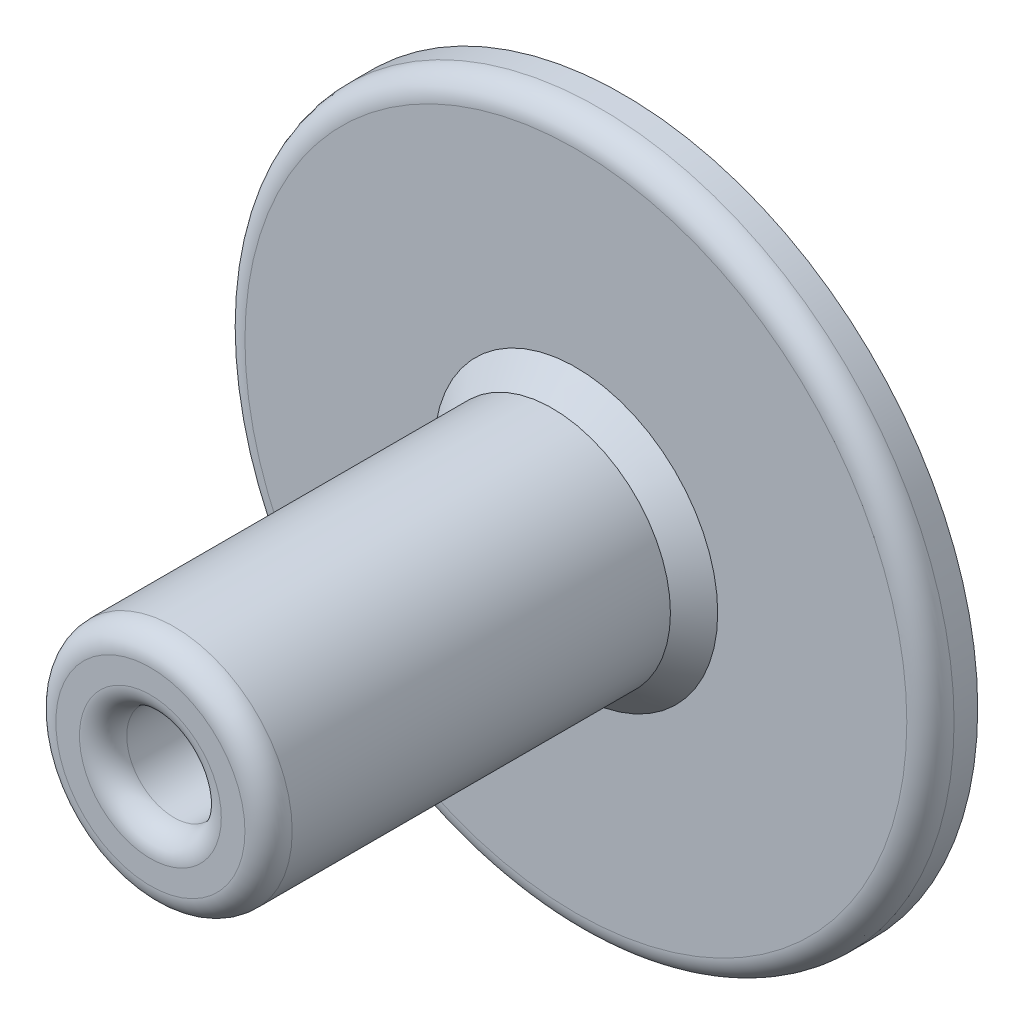
ISO-10303-21;
HEADER;
FILE_DESCRIPTION(('STEP AP214'),'2;1');
FILE_NAME('part.step','',(''),(''),'','','');
FILE_SCHEMA(('AUTOMOTIVE_DESIGN { 1 0 10303 214 1 1 1 1 }'));
ENDSEC;
DATA;
#1=APPLICATION_CONTEXT('core data for automotive mechanical design processes');
#2=APPLICATION_PROTOCOL_DEFINITION('international standard','automotive_design',2000,#1);
#3=PRODUCT_CONTEXT('',#1,'mechanical');
#4=PRODUCT('Part','Part','',(#3));
#5=PRODUCT_RELATED_PRODUCT_CATEGORY('part','',(#4));
#6=PRODUCT_DEFINITION_FORMATION('','',#4);
#7=PRODUCT_DEFINITION_CONTEXT('part definition',#1,'design');
#8=PRODUCT_DEFINITION('design','',#6,#7);
#9=PRODUCT_DEFINITION_SHAPE('','',#8);
#10=(LENGTH_UNIT() NAMED_UNIT(*) SI_UNIT(.MILLI.,.METRE.));
#11=(NAMED_UNIT(*) PLANE_ANGLE_UNIT() SI_UNIT($,.RADIAN.));
#12=(NAMED_UNIT(*) SI_UNIT($,.STERADIAN.) SOLID_ANGLE_UNIT());
#13=UNCERTAINTY_MEASURE_WITH_UNIT(LENGTH_MEASURE(1.E-05),#10,'distance_accuracy_value','');
#14=(GEOMETRIC_REPRESENTATION_CONTEXT(3) GLOBAL_UNCERTAINTY_ASSIGNED_CONTEXT((#13)) GLOBAL_UNIT_ASSIGNED_CONTEXT((#10,
#11,#12)) REPRESENTATION_CONTEXT('',''));
#15=CARTESIAN_POINT('',(0.,0.,0.));
#16=DIRECTION('',(0.,0.,1.));
#17=DIRECTION('',(1.,0.,0.));
#18=AXIS2_PLACEMENT_3D('',#15,#16,#17);
#19=CARTESIAN_POINT('',(0.,0.,2.));
#20=DIRECTION('',(0.,0.,-1.));
#21=DIRECTION('',(-1.,0.,0.));
#22=AXIS2_PLACEMENT_3D('',#19,#20,#21);
#23=CYLINDRICAL_SURFACE('',#22,15.);
#24=CARTESIAN_POINT('',(0.,0.,1.));
#25=DIRECTION('',(0.,0.,1.));
#26=DIRECTION('',(1.,0.,0.));
#27=AXIS2_PLACEMENT_3D('',#24,#25,#26);
#28=CIRCLE('',#27,15.);
#29=CARTESIAN_POINT('',(15.,0.,1.));
#30=VERTEX_POINT('',#29);
#31=EDGE_CURVE('E53',#30,#30,#28,.F.);
#32=ORIENTED_EDGE('',*,*,#31,.T.);
#33=EDGE_LOOP('',(#32));
#34=FACE_BOUND('',#33,.T.);
#35=CARTESIAN_POINT('',(0.,0.,0.));
#36=DIRECTION('',(0.,0.,1.));
#37=DIRECTION('',(1.,0.,0.));
#38=AXIS2_PLACEMENT_3D('',#35,#36,#37);
#39=CIRCLE('',#38,15.);
#40=CARTESIAN_POINT('',(15.,0.,0.));
#41=VERTEX_POINT('',#40);
#42=EDGE_CURVE('E141',#41,#41,#39,.T.);
#43=ORIENTED_EDGE('',*,*,#42,.T.);
#44=EDGE_LOOP('',(#43));
#45=FACE_BOUND('',#44,.T.);
#46=ADVANCED_FACE('F33',(#34,#45),#23,.T.);
#47=CARTESIAN_POINT('',(0.,0.,2.));
#48=DIRECTION('',(0.,0.,1.));
#49=DIRECTION('',(1.,0.,0.));
#50=AXIS2_PLACEMENT_3D('',#47,#48,#49);
#51=PLANE('',#50);
#52=CARTESIAN_POINT('',(0.,0.,2.));
#53=DIRECTION('',(0.,0.,1.));
#54=DIRECTION('',(1.,0.,0.));
#55=AXIS2_PLACEMENT_3D('',#52,#53,#54);
#56=CIRCLE('',#55,14.);
#57=CARTESIAN_POINT('',(14.,0.,2.));
#58=VERTEX_POINT('',#57);
#59=EDGE_CURVE('E56',#58,#58,#56,.T.);
#60=ORIENTED_EDGE('',*,*,#59,.T.);
#61=EDGE_LOOP('',(#60));
#62=FACE_BOUND('',#61,.T.);
#63=CARTESIAN_POINT('',(0.,0.,2.));
#64=DIRECTION('',(0.,0.,1.));
#65=DIRECTION('',(1.,0.,0.));
#66=AXIS2_PLACEMENT_3D('',#63,#64,#65);
#67=CIRCLE('',#66,6.);
#68=CARTESIAN_POINT('',(6.,0.,2.));
#69=VERTEX_POINT('',#68);
#70=EDGE_CURVE('E59',#69,#69,#67,.F.);
#71=ORIENTED_EDGE('',*,*,#70,.T.);
#72=EDGE_LOOP('',(#71));
#73=FACE_BOUND('',#72,.T.);
#74=ADVANCED_FACE('F105',(#62,#73),#51,.T.);
#75=CARTESIAN_POINT('',(0.,0.,0.));
#76=DIRECTION('',(0.,0.,1.));
#77=DIRECTION('',(1.,0.,0.));
#78=AXIS2_PLACEMENT_3D('',#75,#76,#77);
#79=PLANE('',#78);
#80=CARTESIAN_POINT('',(-3.66679137106912,-0.429664729131932,0.));
#81=CARTESIAN_POINT('',(-2.67863752521124,-0.276198195593573,0.));
#82=CARTESIAN_POINT('',(-2.67863752521124,-0.276198195593573,1.));
#83=CARTESIAN_POINT('',(-3.69196284115089,-0.267625344794725,0.));
#84=CARTESIAN_POINT('',(-2.69486440992087,-0.171736758762703,0.));
#85=CARTESIAN_POINT('',(-2.69486440992087,-0.171736758762703,1.));
#86=CARTESIAN_POINT('',(-3.70290083888142,-0.103396836765117,0.));
#87=CARTESIAN_POINT('',(-2.70186208637592,-0.0663814484191467,0.));
#88=CARTESIAN_POINT('',(-2.70186208637592,-0.0663814484191467,1.));
#89=CARTESIAN_POINT('',(-3.69578827229148,0.22440005978216,0.));
#90=CARTESIAN_POINT('',(-2.69729640552077,0.144056797802076,0.));
#91=CARTESIAN_POINT('',(-2.69729640552077,0.144056797802076,1.));
#92=CARTESIAN_POINT('',(-3.67774673628734,0.387968637980828,0.));
#93=CARTESIAN_POINT('',(-2.68573882893539,0.249139808297535,0.));
#94=CARTESIAN_POINT('',(-2.68573882893539,0.249139808297535,1.));
#95=CARTESIAN_POINT('',(-3.61488777481417,0.703048246575832,0.));
#96=CARTESIAN_POINT('',(-2.64510508481496,0.452798082427513,0.));
#97=CARTESIAN_POINT('',(-2.64510508481496,0.452798082427513,1.));
#98=CARTESIAN_POINT('',(-3.57116384486128,0.854780094129729,0.));
#99=CARTESIAN_POINT('',(-2.61674396592666,0.551465948864588,0.));
#100=CARTESIAN_POINT('',(-2.61674396592666,0.551465948864588,1.));
#101=CARTESIAN_POINT('',(-3.45979416995086,1.14915436400107,0.));
#102=CARTESIAN_POINT('',(-2.54361641143537,0.744750712859358,0.));
#103=CARTESIAN_POINT('',(-2.54361641143537,0.744750712859358,1.));
#104=CARTESIAN_POINT('',(-3.39214641981463,1.29179602323988,0.));
#105=CARTESIAN_POINT('',(-2.49884860069155,0.839367270110499,0.));
#106=CARTESIAN_POINT('',(-2.49884860069155,0.839367270110499,1.));
#107=CARTESIAN_POINT('',(-3.23256253772176,1.57019486369897,0.));
#108=CARTESIAN_POINT('',(-2.39172473982422,1.02624113576221,0.));
#109=CARTESIAN_POINT('',(-2.39172473982422,1.02624113576221,1.));
#110=CARTESIAN_POINT('',(-3.13978051906936,1.70546513962709,0.));
#111=CARTESIAN_POINT('',(-2.32874970424368,1.11826173600873,0.));
#112=CARTESIAN_POINT('',(-2.32874970424368,1.11826173600873,1.));
#113=CARTESIAN_POINT('',(-2.93477283978381,1.96031714465642,0.));
#114=CARTESIAN_POINT('',(-2.18747117797549,1.29388587420969,0.));
#115=CARTESIAN_POINT('',(-2.18747117797549,1.29388587420969,1.));
#116=CARTESIAN_POINT('',(-2.8225403644038,2.07989334922363,0.));
#117=CARTESIAN_POINT('',(-2.10916231360764,1.37748644579949,0.));
#118=CARTESIAN_POINT('',(-2.10916231360764,1.37748644579949,1.));
#119=CARTESIAN_POINT('',(-2.56999998825387,2.31298075386542,0.));
#120=CARTESIAN_POINT('',(-1.93044708830676,1.54243084880331,0.));
#121=CARTESIAN_POINT('',(-1.93044708830676,1.54243084880331,1.));
#122=CARTESIAN_POINT('',(-2.42800063400787,2.42465555803301,0.));
#123=CARTESIAN_POINT('',(-1.82860687266657,1.6226913846006,0.));
#124=CARTESIAN_POINT('',(-1.82860687266657,1.6226913846006,1.));
#125=CARTESIAN_POINT('',(-2.12916184998968,2.62591013207903,0.));
#126=CARTESIAN_POINT('',(-1.61143562510416,1.76894605512826,0.));
#127=CARTESIAN_POINT('',(-1.61143562510416,1.76894605512826,1.));
#128=CARTESIAN_POINT('',(-1.97231521701206,2.71547910043965,0.));
#129=CARTESIAN_POINT('',(-1.49609803841159,1.83493321355669,0.));
#130=CARTESIAN_POINT('',(-1.49609803841159,1.83493321355669,1.));
#131=CARTESIAN_POINT('',(-1.62585529354339,2.88261068326477,0.));
#132=CARTESIAN_POINT('',(-1.23870883521219,1.95909371042911,0.));
#133=CARTESIAN_POINT('',(-1.23870883521219,1.95909371042911,1.));
#134=CARTESIAN_POINT('',(-1.43467536350821,2.95692637081147,0.));
#135=CARTESIAN_POINT('',(-1.09515208161474,2.01501404682388,0.));
#136=CARTESIAN_POINT('',(-1.09515208161474,2.01501404682388,1.));
#137=CARTESIAN_POINT('',(-1.04341001361871,3.07636366786913,0.));
#138=CARTESIAN_POINT('',(-0.799084610705838,2.10539316362338,0.));
#139=CARTESIAN_POINT('',(-0.799084610705838,2.10539316362338,1.));
#140=CARTESIAN_POINT('',(-0.843319806112145,3.12146937501118,0.));
#141=CARTESIAN_POINT('',(-0.646569065283026,2.13984025327666,0.));
#142=CARTESIAN_POINT('',(-0.646569065283026,2.13984025327666,1.));
#143=CARTESIAN_POINT('',(-0.413886812776147,3.18627934972078,0.));
#144=CARTESIAN_POINT('',(-0.317981132365736,2.18942738087526,0.));
#145=CARTESIAN_POINT('',(-0.317981132365736,2.18942738087526,1.));
#146=CARTESIAN_POINT('',(-0.183965469486591,3.2021908742441,0.));
#147=CARTESIAN_POINT('',(-0.141313310718633,2.20168218703826,0.));
#148=CARTESIAN_POINT('',(-0.141313310718633,2.20168218703826,1.));
#149=CARTESIAN_POINT('',(0.275564486722363,3.19732283806334,0.));
#150=CARTESIAN_POINT('',(0.211677105483799,2.197944262004,0.));
#151=CARTESIAN_POINT('',(0.211677105483799,2.197944262004,1.));
#152=CARTESIAN_POINT('',(0.505172891180243,3.17652529357534,0.));
#153=CARTESIAN_POINT('',(0.3879994884411,2.18193768554574,0.));
#154=CARTESIAN_POINT('',(0.3879994884411,2.18193768554574,1.));
#155=CARTESIAN_POINT('',(0.969908678865284,3.09607322811161,0.));
#156=CARTESIAN_POINT('',(0.743169352262732,2.12044962602762,0.));
#157=CARTESIAN_POINT('',(0.743169352262732,2.12044962602762,1.));
#158=CARTESIAN_POINT('',(1.20470226014694,3.03445452538999,0.));
#159=CARTESIAN_POINT('',(0.921671424748289,2.07347883910119,0.));
#160=CARTESIAN_POINT('',(0.921671424748289,2.07347883910119,1.));
#161=CARTESIAN_POINT('',(1.6596999539275,2.87032749397285,0.));
#162=CARTESIAN_POINT('',(1.26414124990438,1.94994297084059,0.));
#163=CARTESIAN_POINT('',(1.26414124990438,1.94994297084059,1.));
#164=CARTESIAN_POINT('',(1.8799055353558,2.76782328953702,0.));
#165=CARTESIAN_POINT('',(1.42811046651516,1.87338087450663,0.));
#166=CARTESIAN_POINT('',(1.42811046651516,1.87338087450663,1.));
#167=CARTESIAN_POINT('',(2.28470356489826,2.5295557318661,0.));
#168=CARTESIAN_POINT('',(1.72517965035663,1.69852773686734,0.));
#169=CARTESIAN_POINT('',(1.72517965035663,1.69852773686734,1.));
#170=CARTESIAN_POINT('',(2.47061834992357,2.39605529732132,0.));
#171=CARTESIAN_POINT('',(1.85951556039085,1.60174711532892,0.));
#172=CARTESIAN_POINT('',(1.85951556039085,1.60174711532892,1.));
#173=CARTESIAN_POINT('',(2.81264792537865,2.09502858966056,0.));
#174=CARTESIAN_POINT('',(2.10258090416348,1.38783406381376,0.));
#175=CARTESIAN_POINT('',(2.10258090416348,1.38783406381376,1.));
#176=CARTESIAN_POINT('',(2.96879364628895,1.92753801059527,0.));
#177=CARTESIAN_POINT('',(2.21133694352171,1.27072300192919,0.));
#178=CARTESIAN_POINT('',(2.21133694352171,1.27072300192919,1.));
#179=CARTESIAN_POINT('',(3.22256784535665,1.58868950833391,0.));
#180=CARTESIAN_POINT('',(2.38517769711205,1.03862176710611,0.));
#181=CARTESIAN_POINT('',(2.38517769711205,1.03862176710611,1.));
#182=CARTESIAN_POINT('',(3.32533554268575,1.42118091245026,0.));
#183=CARTESIAN_POINT('',(2.45425127347584,0.925645205121941,0.));
#184=CARTESIAN_POINT('',(2.45425127347584,0.925645205121941,1.));
#185=CARTESIAN_POINT('',(3.49592307664385,1.06939013346013,0.));
#186=CARTESIAN_POINT('',(2.56759738815636,0.691928726733301,0.));
#187=CARTESIAN_POINT('',(2.56759738815636,0.691928726733301,1.));
#188=CARTESIAN_POINT('',(3.563823234721,0.885147662585903,0.));
#189=CARTESIAN_POINT('',(2.61192694790284,0.57120738024641,0.));
#190=CARTESIAN_POINT('',(2.61192694790284,0.57120738024641,1.));
#191=CARTESIAN_POINT('',(3.64121550411415,0.582465118036167,0.));
#192=CARTESIAN_POINT('',(2.66215642196467,0.374736165586794,0.));
#193=CARTESIAN_POINT('',(2.66215642196467,0.374736165586794,1.));
#194=CARTESIAN_POINT('',(3.66320207058828,0.467090301364075,0.));
#195=CARTESIAN_POINT('',(2.67633203343179,0.300254571662592,0.));
#196=CARTESIAN_POINT('',(2.67633203343179,0.300254571662592,1.));
#197=CARTESIAN_POINT('',(3.69259622199586,0.234491874644264,0.));
#198=CARTESIAN_POINT('',(2.6952540558872,0.150525026615704,0.));
#199=CARTESIAN_POINT('',(2.6952540558872,0.150525026615704,1.));
#200=CARTESIAN_POINT('',(3.70000565968826,0.117268501458176,0.));
#201=CARTESIAN_POINT('',(2.70000166517907,0.0752771741069899,0.));
#202=CARTESIAN_POINT('',(2.70000166517907,0.0752771741069899,1.));
#203=CARTESIAN_POINT('',(3.69999221530154,-0.161298622961428,0.));
#204=CARTESIAN_POINT('',(2.69999770960584,-0.103541056405876,0.));
#205=CARTESIAN_POINT('',(2.69999770960584,-0.103541056405876,1.));
#206=CARTESIAN_POINT('',(3.68595579522654,-0.322682624177757,0.));
#207=CARTESIAN_POINT('',(2.69101025874301,-0.207137586394251,0.));
#208=CARTESIAN_POINT('',(2.69101025874301,-0.207137586394251,1.));
#209=CARTESIAN_POINT('',(3.63046135021982,-0.640735894161588,0.));
#210=CARTESIAN_POINT('',(2.65519305293397,-0.412395100761501,0.));
#211=CARTESIAN_POINT('',(2.65519305293397,-0.412395100761501,1.));
#212=CARTESIAN_POINT('',(3.58897887883745,-0.79740082942815,0.));
#213=CARTESIAN_POINT('',(2.62834739139935,-0.514054276395481,0.));
#214=CARTESIAN_POINT('',(2.62834739139934,-0.514054276395481,1.));
#215=CARTESIAN_POINT('',(3.480677995131,-1.10118683841204,0.));
#216=CARTESIAN_POINT('',(2.55739380971988,-0.713070999785491,0.));
#217=CARTESIAN_POINT('',(2.55739380971988,-0.71307099978549,1.));
#218=CARTESIAN_POINT('',(3.41392849216542,-1.24833260648594,0.));
#219=CARTESIAN_POINT('',(2.51333282952433,-0.810439450185369,0.));
#220=CARTESIAN_POINT('',(2.51333282952433,-0.810439450185369,1.));
#221=CARTESIAN_POINT('',(3.25792467759618,-1.53007955988212,0.));
#222=CARTESIAN_POINT('',(2.40885223136151,-0.999127264545141,0.));
#223=CARTESIAN_POINT('',(2.40885223136151,-0.999127264545141,1.));
#224=CARTESIAN_POINT('',(3.16866961804213,-1.6646803280798,0.));
#225=CARTESIAN_POINT('',(2.34843206970774,-1.09044642733543,0.));
#226=CARTESIAN_POINT('',(2.34843206970774,-1.09044642733543,1.));
#227=CARTESIAN_POINT('',(2.96555857684176,-1.92578556761755,0.));
#228=CARTESIAN_POINT('',(2.20885934629013,-1.26986571212071,0.));
#229=CARTESIAN_POINT('',(2.20885934629013,-1.2698657121207,1.));
#230=CARTESIAN_POINT('',(2.85062856328575,-2.05145145214222,0.));
#231=CARTESIAN_POINT('',(2.12886664528323,-1.35752057837446,0.));
#232=CARTESIAN_POINT('',(2.12886664528323,-1.35752057837446,1.));
#233=CARTESIAN_POINT('',(2.6033686661681,-2.28424678524821,0.));
#234=CARTESIAN_POINT('',(1.95420258988627,-1.52196461200997,0.));
#235=CARTESIAN_POINT('',(1.95420258988627,-1.52196461200997,1.));
#236=CARTESIAN_POINT('',(2.47103178234493,-2.39136873593577,0.));
#237=CARTESIAN_POINT('',(1.85952532726578,-1.59874938199514,0.));
#238=CARTESIAN_POINT('',(1.85952532726578,-1.59874938199514,1.));
#239=CARTESIAN_POINT('',(2.17576754890437,-2.5978974545848,0.));
#240=CARTESIAN_POINT('',(1.64558126348463,-1.74839298753501,0.));
#241=CARTESIAN_POINT('',(1.64558126348463,-1.74839298753501,1.));
#242=CARTESIAN_POINT('',(2.01107727077518,-2.69478072158803,0.));
#243=CARTESIAN_POINT('',(1.52472426218929,-1.81963813019836,0.));
#244=CARTESIAN_POINT('',(1.52472426218929,-1.81963813019836,1.));
#245=CARTESIAN_POINT('',(1.66928851891708,-2.86333576856751,0.));
#246=CARTESIAN_POINT('',(1.27111921312683,-1.94470572163907,0.));
#247=CARTESIAN_POINT('',(1.27111921312683,-1.94470572163907,1.));
#248=CARTESIAN_POINT('',(1.49218342864956,-2.93499398032098,0.));
#249=CARTESIAN_POINT('',(1.13836481392189,-1.99851879269868,0.));
#250=CARTESIAN_POINT('',(1.13836481392189,-1.99851879269868,1.));
#251=CARTESIAN_POINT('',(1.10504189432178,-3.0609821850241,0.));
#252=CARTESIAN_POINT('',(0.845959906283273,-2.0936733340277,0.));
#253=CARTESIAN_POINT('',(0.845959906283273,-2.0936733340277,1.));
#254=CARTESIAN_POINT('',(0.893803491422409,-3.11162780922007,0.));
#255=CARTESIAN_POINT('',(0.685107538530087,-2.13232161663707,0.));
#256=CARTESIAN_POINT('',(0.685107538530087,-2.13232161663707,1.));
#257=CARTESIAN_POINT('',(0.466069341538089,-3.18025682086627,0.));
#258=CARTESIAN_POINT('',(0.357984961391087,-2.18480980832928,0.));
#259=CARTESIAN_POINT('',(0.357984961391087,-2.18480980832928,1.));
#260=CARTESIAN_POINT('',(0.24957095767294,-3.19822346876306,0.));
#261=CARTESIAN_POINT('',(0.191712019721107,-2.19863700295396,0.));
#262=CARTESIAN_POINT('',(0.191712019721107,-2.19863700295396,1.));
#263=CARTESIAN_POINT('',(-0.204889539880636,-3.20168652521735,0.));
#264=CARTESIAN_POINT('',(-0.157388709528231,-2.20129369234364,0.));
#265=CARTESIAN_POINT('',(-0.157388709528231,-2.20129369234364,1.));
#266=CARTESIAN_POINT('',(-0.442884775254164,-3.18384368448947,0.));
#267=CARTESIAN_POINT('',(-0.340248812287646,-2.18755246078413,0.));
#268=CARTESIAN_POINT('',(-0.340248812287646,-2.18755246078413,1.));
#269=CARTESIAN_POINT('',(-0.912744009262694,-3.10872065287954,0.));
#270=CARTESIAN_POINT('',(-0.699597838564381,-2.13009880404799,0.));
#271=CARTESIAN_POINT('',(-0.699597838564381,-2.13009880404799,1.));
#272=CARTESIAN_POINT('',(-1.1446047439544,-3.0514198892882,0.));
#273=CARTESIAN_POINT('',(-0.876083387952236,-2.0863707442837,0.));
#274=CARTESIAN_POINT('',(-0.876083387952235,-2.0863707442837,1.));
#275=CARTESIAN_POINT('',(-1.5958951215508,-2.89692108579479,0.));
#276=CARTESIAN_POINT('',(-1.21638286266174,-1.96986755979153,0.));
#277=CARTESIAN_POINT('',(-1.21638286266174,-1.96986755979153,1.));
#278=CARTESIAN_POINT('',(-1.81526650993482,-2.79955114465823,0.));
#279=CARTESIAN_POINT('',(-1.38013853152023,-1.89696732079462,0.));
#280=CARTESIAN_POINT('',(-1.38013853152023,-1.89696732079462,1.));
#281=CARTESIAN_POINT('',(-2.23175412028203,-2.56532027483433,0.));
#282=CARTESIAN_POINT('',(-1.6867091774108,-1.72455643072024,0.));
#283=CARTESIAN_POINT('',(-1.6867091774108,-1.72455643072024,1.));
#284=CARTESIAN_POINT('',(-2.42890490865218,-2.4285218943245,0.));
#285=CARTESIAN_POINT('',(-1.82955678541328,-1.62508794494161,0.));
#286=CARTESIAN_POINT('',(-1.82955678541328,-1.62508794494161,1.));
#287=CARTESIAN_POINT('',(-2.74688715022874,-2.15550994819333,0.));
#288=CARTESIAN_POINT('',(-2.05604176594893,-1.43064908480689,0.));
#289=CARTESIAN_POINT('',(-2.05604176594893,-1.43064908480689,1.));
#290=CARTESIAN_POINT('',(-2.87460708535612,-2.0272843419599,0.));
#291=CARTESIAN_POINT('',(-2.14562404098936,-1.34049395975403,0.));
#292=CARTESIAN_POINT('',(-2.14562404098936,-1.34049395975403,1.));
#293=CARTESIAN_POINT('',(-3.10702019729826,-1.75136755234918,0.));
#294=CARTESIAN_POINT('',(-2.30642899839671,-1.1495918155782,0.));
#295=CARTESIAN_POINT('',(-2.30642899839671,-1.1495918155782,1.));
#296=CARTESIAN_POINT('',(-3.21172638085104,-1.60368744000086,0.));
#297=CARTESIAN_POINT('',(-2.37766205517163,-1.04885082712966,0.));
#298=CARTESIAN_POINT('',(-2.37766205517163,-1.04885082712966,1.));
#299=CARTESIAN_POINT('',(-3.39390910770414,-1.29125446141625,0.));
#300=CARTESIAN_POINT('',(-2.50009991204517,-0.83889044401713,0.));
#301=CARTESIAN_POINT('',(-2.50009991204516,-0.83889044401713,1.));
#302=CARTESIAN_POINT('',(-3.47124208550358,-1.12641728209095,0.));
#303=CARTESIAN_POINT('',(-2.55119926971799,-0.729629911425918,0.));
#304=CARTESIAN_POINT('',(-2.55119926971799,-0.729629911425917,1.));
#305=CARTESIAN_POINT('',(-3.59376655523474,-0.785162958027096,0.));
#306=CARTESIAN_POINT('',(-2.63149639321124,-0.506008123502712,0.));
#307=CARTESIAN_POINT('',(-2.63149639321124,-0.506008123502713,1.));
#308=CARTESIAN_POINT('',(-3.63897183740352,-0.608750817194219,0.));
#309=CARTESIAN_POINT('',(-2.66070355615814,-0.39164907904346,0.));
#310=CARTESIAN_POINT('',(-2.66070355615814,-0.391649079043461,1.));
#311=CARTESIAN_POINT('',(-3.66679137106912,-0.429664729131932,0.));
#312=CARTESIAN_POINT('',(-2.67863752521124,-0.276198195593573,0.));
#313=CARTESIAN_POINT('',(-2.67863752521124,-0.276198195593573,1.));
#314=(BOUNDED_SURFACE() B_SPLINE_SURFACE(3,2,((#80,#81,#82),(#83,#84,#85),(#86,#87,#88),(#89,
#90,#91),(#92,#93,#94),(#95,#96,#97),(#98,#99,#100),(#101,#102,#103),(#104,#105,#106),(#107,
#108,#109),(#110,#111,#112),(#113,#114,#115),(#116,#117,#118),(#119,#120,#121),(#122,#123,#124),
(#125,#126,#127),(#128,#129,#130),(#131,#132,#133),(#134,#135,#136),(#137,#138,#139),(#140,#141,
#142),(#143,#144,#145),(#146,#147,#148),(#149,#150,#151),(#152,#153,#154),(#155,#156,#157),
(#158,#159,#160),(#161,#162,#163),(#164,#165,#166),(#167,#168,#169),(#170,#171,#172),(#173,#174,
#175),(#176,#177,#178),(#179,#180,#181),(#182,#183,#184),(#185,#186,#187),(#188,#189,#190),
(#191,#192,#193),(#194,#195,#196),(#197,#198,#199),(#200,#201,#202),(#203,#204,#205),(#206,#207,
#208),(#209,#210,#211),(#212,#213,#214),(#215,#216,#217),(#218,#219,#220),(#221,#222,#223),
(#224,#225,#226),(#227,#228,#229),(#230,#231,#232),(#233,#234,#235),(#236,#237,#238),(#239,#240,
#241),(#242,#243,#244),(#245,#246,#247),(#248,#249,#250),(#251,#252,#253),(#254,#255,#256),
(#257,#258,#259),(#260,#261,#262),(#263,#264,#265),(#266,#267,#268),(#269,#270,#271),(#272,#273,
#274),(#275,#276,#277),(#278,#279,#280),(#281,#282,#283),(#284,#285,#286),(#287,#288,#289),
(#290,#291,#292),(#293,#294,#295),(#296,#297,#298),(#299,#300,#301),(#302,#303,#304),(#305,#306,
#307),(#308,#309,#310),(#311,#312,#313)),.UNSPECIFIED.,.T.,.F.,
.F.) B_SPLINE_SURFACE_WITH_KNOTS((4,2,2,2,2,2,2,2,2,2,2,2,2,2,2,2,2,2,2,2,2,2,2,2,2,2,2,2,2,2,2,
2,2,2,2,2,2,2,4),(3,3),(0.,0.491271557679719,0.982390093751996,1.45397540168436,
1.92560024498385,2.41565647302596,2.90588474770954,3.44569147774532,3.9857614522587,
4.59864643869533,5.21186480939546,5.90027306099648,6.58901865761808,7.31357631355176,
8.03806089936582,8.7207009594845,9.40262783458873,9.98874854198128,10.5735129256247,
10.9250367788066,11.2765159502782,11.7599629599444,12.2438411610641,12.7264091065563,
13.2089930918415,13.7178257439804,14.2268636549981,14.7978212197408,15.3690854274001,
16.0180778798104,16.6674026800724,17.3800836759102,18.0931365334712,18.809280897758,
19.5242953852591,20.0649952353538,20.6053887064965,21.1485758129931,21.6915296251234),(0.,1.),
.UNSPECIFIED.) GEOMETRIC_REPRESENTATION_ITEM() RATIONAL_B_SPLINE_SURFACE(((1.,0.707106781186548,
1.),(1.,0.707106781186548,1.),(1.,0.707106781186548,1.),(1.,0.707106781186548,1.),(1.,
0.707106781186548,1.),(1.,0.707106781186548,1.),(1.,0.707106781186548,1.),(1.,0.707106781186548,
1.),(1.,0.707106781186548,1.),(1.,0.707106781186548,1.),(1.,0.707106781186548,1.),(1.,
0.707106781186548,1.),(1.,0.707106781186548,1.),(1.,0.707106781186548,1.),(1.,0.707106781186548,
1.),(1.,0.707106781186548,1.),(1.,0.707106781186548,1.),(1.,0.707106781186548,1.),(1.,
0.707106781186548,1.),(1.,0.707106781186548,1.),(1.,0.707106781186548,1.),(1.,0.707106781186548,
1.),(1.,0.707106781186548,1.),(1.,0.707106781186548,1.),(1.,0.707106781186548,1.),(1.,
0.707106781186548,1.),(1.,0.707106781186548,1.),(1.,0.707106781186548,1.),(1.,0.707106781186548,
1.),(1.,0.707106781186548,1.),(1.,0.707106781186548,1.),(1.,0.707106781186548,1.),(1.,
0.707106781186548,1.),(1.,0.707106781186548,1.),(1.,0.707106781186548,1.),(1.,0.707106781186548,
1.),(1.,0.707106781186548,1.),(1.,0.707106781186548,1.),(1.,0.707106781186548,1.),(1.,
0.707106781186548,1.),(1.,0.707106781186548,1.),(1.,0.707106781186548,1.),(1.,0.707106781186548,
1.),(1.,0.707106781186548,1.),(1.,0.707106781186548,1.),(1.,0.707106781186548,1.),(1.,
0.707106781186548,1.),(1.,0.707106781186548,1.),(1.,0.707106781186548,1.),(1.,0.707106781186548,
1.),(1.,0.707106781186548,1.),(1.,0.707106781186548,1.),(1.,0.707106781186548,1.),(1.,
0.707106781186548,1.),(1.,0.707106781186548,1.),(1.,0.707106781186548,1.),(1.,0.707106781186548,
1.),(1.,0.707106781186548,1.),(1.,0.707106781186548,1.),(1.,0.707106781186548,1.),(1.,
0.707106781186548,1.),(1.,0.707106781186548,1.),(1.,0.707106781186548,1.),(1.,0.707106781186548,
1.),(1.,0.707106781186548,1.),(1.,0.707106781186548,1.),(1.,0.707106781186548,1.),(1.,
0.707106781186548,1.),(1.,0.707106781186548,1.),(1.,0.707106781186548,1.),(1.,0.707106781186548,
1.),(1.,0.707106781186548,1.),(1.,0.707106781186548,1.),(1.,0.707106781186548,1.),(1.,
0.707106781186548,1.),(1.,0.707106781186548,1.),(1.,0.707106781186548,1.),(1.,0.707106781186548,1.))) REPRESENTATION_ITEM('') SURFACE());
#315=CARTESIAN_POINT('',(-3.66679137106912,-0.429664729131932,0.));
#316=CARTESIAN_POINT('',(-3.63897183740352,-0.608750817194218,0.));
#317=CARTESIAN_POINT('',(-3.59376655523474,-0.785162958027095,0.));
#318=CARTESIAN_POINT('',(-3.47124208550358,-1.12641728209095,0.));
#319=CARTESIAN_POINT('',(-3.39390910770414,-1.29125446141625,0.));
#320=CARTESIAN_POINT('',(-3.21172638085104,-1.60368744000086,0.));
#321=CARTESIAN_POINT('',(-3.10702019729826,-1.75136755234918,0.));
#322=CARTESIAN_POINT('',(-2.87460708535611,-2.0272843419599,0.));
#323=CARTESIAN_POINT('',(-2.74688715022874,-2.15550994819333,0.));
#324=CARTESIAN_POINT('',(-2.42890490865218,-2.4285218943245,0.));
#325=CARTESIAN_POINT('',(-2.23175412028203,-2.56532027483433,0.));
#326=CARTESIAN_POINT('',(-1.81526650993482,-2.79955114465823,0.));
#327=CARTESIAN_POINT('',(-1.5958951215508,-2.89692108579479,0.));
#328=CARTESIAN_POINT('',(-1.1446047439544,-3.0514198892882,0.));
#329=CARTESIAN_POINT('',(-0.912744009262693,-3.10872065287954,0.));
#330=CARTESIAN_POINT('',(-0.442884775254164,-3.18384368448947,0.));
#331=CARTESIAN_POINT('',(-0.204889539880636,-3.20168652521735,0.));
#332=CARTESIAN_POINT('',(0.249570957672939,-3.19822346876306,0.));
#333=CARTESIAN_POINT('',(0.466069341538089,-3.18025682086627,0.));
#334=CARTESIAN_POINT('',(0.89380349142241,-3.11162780922007,0.));
#335=CARTESIAN_POINT('',(1.10504189432178,-3.0609821850241,0.));
#336=CARTESIAN_POINT('',(1.49218342864955,-2.93499398032098,0.));
#337=CARTESIAN_POINT('',(1.66928851891708,-2.86333576856751,0.));
#338=CARTESIAN_POINT('',(2.01107727077518,-2.69478072158803,0.));
#339=CARTESIAN_POINT('',(2.17576754890437,-2.5978974545848,0.));
#340=CARTESIAN_POINT('',(2.47103178234493,-2.39136873593577,0.));
#341=CARTESIAN_POINT('',(2.6033686661681,-2.28424678524821,0.));
#342=CARTESIAN_POINT('',(2.85062856328575,-2.05145145214222,0.));
#343=CARTESIAN_POINT('',(2.96555857684176,-1.92578556761755,0.));
#344=CARTESIAN_POINT('',(3.16866961804213,-1.6646803280798,0.));
#345=CARTESIAN_POINT('',(3.25792467759618,-1.53007955988212,0.));
#346=CARTESIAN_POINT('',(3.41392849216542,-1.24833260648594,0.));
#347=CARTESIAN_POINT('',(3.480677995131,-1.10118683841204,0.));
#348=CARTESIAN_POINT('',(3.58897887883745,-0.79740082942815,0.));
#349=CARTESIAN_POINT('',(3.63046135021982,-0.640735894161588,0.));
#350=CARTESIAN_POINT('',(3.68595579522654,-0.322682624177758,0.));
#351=CARTESIAN_POINT('',(3.69999221530154,-0.161298622961429,0.));
#352=CARTESIAN_POINT('',(3.70000565968826,0.117268501458176,0.));
#353=CARTESIAN_POINT('',(3.69259622199586,0.234491874644264,0.));
#354=CARTESIAN_POINT('',(3.66320207058828,0.467090301364076,0.));
#355=CARTESIAN_POINT('',(3.64121550411415,0.582465118036167,0.));
#356=CARTESIAN_POINT('',(3.563823234721,0.885147662585902,0.));
#357=CARTESIAN_POINT('',(3.49592307664385,1.06939013346013,0.));
#358=CARTESIAN_POINT('',(3.32533554268575,1.42118091245026,0.));
#359=CARTESIAN_POINT('',(3.22256784535665,1.58868950833391,0.));
#360=CARTESIAN_POINT('',(2.96879364628895,1.92753801059527,0.));
#361=CARTESIAN_POINT('',(2.81264792537865,2.09502858966056,0.));
#362=CARTESIAN_POINT('',(2.47061834992357,2.39605529732132,0.));
#363=CARTESIAN_POINT('',(2.28470356489826,2.5295557318661,0.));
#364=CARTESIAN_POINT('',(1.8799055353558,2.76782328953702,0.));
#365=CARTESIAN_POINT('',(1.6596999539275,2.87032749397285,0.));
#366=CARTESIAN_POINT('',(1.20470226014694,3.03445452538999,0.));
#367=CARTESIAN_POINT('',(0.969908678865284,3.09607322811161,0.));
#368=CARTESIAN_POINT('',(0.505172891180243,3.17652529357534,0.));
#369=CARTESIAN_POINT('',(0.275564486722363,3.19732283806334,0.));
#370=CARTESIAN_POINT('',(-0.183965469486591,3.2021908742441,0.));
#371=CARTESIAN_POINT('',(-0.413886812776147,3.18627934972078,0.));
#372=CARTESIAN_POINT('',(-0.843319806112145,3.12146937501118,0.));
#373=CARTESIAN_POINT('',(-1.04341001361871,3.07636366786913,0.));
#374=CARTESIAN_POINT('',(-1.43467536350821,2.95692637081147,0.));
#375=CARTESIAN_POINT('',(-1.62585529354339,2.88261068326478,0.));
#376=CARTESIAN_POINT('',(-1.97231521701206,2.71547910043965,0.));
#377=CARTESIAN_POINT('',(-2.12916184998968,2.62591013207903,0.));
#378=CARTESIAN_POINT('',(-2.42800063400787,2.42465555803301,0.));
#379=CARTESIAN_POINT('',(-2.56999998825387,2.31298075386542,0.));
#380=CARTESIAN_POINT('',(-2.8225403644038,2.07989334922363,0.));
#381=CARTESIAN_POINT('',(-2.93477283978381,1.96031714465642,0.));
#382=CARTESIAN_POINT('',(-3.13978051906936,1.70546513962709,0.));
#383=CARTESIAN_POINT('',(-3.23256253772176,1.57019486369897,0.));
#384=CARTESIAN_POINT('',(-3.39214641981463,1.29179602323988,0.));
#385=CARTESIAN_POINT('',(-3.45979416995086,1.14915436400107,0.));
#386=CARTESIAN_POINT('',(-3.57116384486128,0.854780094129729,0.));
#387=CARTESIAN_POINT('',(-3.61488777481417,0.703048246575832,0.));
#388=CARTESIAN_POINT('',(-3.67774673628734,0.387968637980828,0.));
#389=CARTESIAN_POINT('',(-3.69578827229148,0.22440005978216,0.));
#390=CARTESIAN_POINT('',(-3.70290083888142,-0.103396836765117,0.));
#391=CARTESIAN_POINT('',(-3.69196284115089,-0.267625344794725,0.));
#392=CARTESIAN_POINT('',(-3.66679137106912,-0.429664729131932,0.));
#393=B_SPLINE_CURVE_WITH_KNOTS('',3,(#315,#316,#317,#318,#319,#320,#321,#322,#323,#324,#325,
#326,#327,#328,#329,#330,#331,#332,#333,#334,#335,#336,#337,#338,#339,#340,#341,#342,#343,#344,
#345,#346,#347,#348,#349,#350,#351,#352,#353,#354,#355,#356,#357,#358,#359,#360,#361,#362,#363,
#364,#365,#366,#367,#368,#369,#370,#371,#372,#373,#374,#375,#376,#377,#378,#379,#380,#381,#382,
#383,#384,#385,#386,#387,#388,#389,#390,#391,#392),.UNSPECIFIED.,.T.,.F.,(4,2,2,2,2,2,2,2,2,2,2,
2,2,2,2,2,2,2,2,2,2,2,2,2,2,2,2,2,2,2,2,2,2,2,2,2,2,2,4),(0.,0.542953812130265,1.0861409186269,
1.62653438976962,2.16723423986433,2.88224872736537,3.59839309165224,4.31144594921321,
5.024126945051,5.673451745313,6.32244419772327,6.89370840538263,7.46466597012527,
7.97370388114302,8.48253653328194,8.96512051856706,9.44768846405929,9.93156666517903,
10.4150136748452,10.7664928463168,11.1180166994987,11.7027810831421,12.2889017905347,
12.9708286656389,13.6534687257576,14.3779533115716,15.1025109675053,15.7912565641269,
16.4796648157279,17.0928831864281,17.7057681728647,18.2458381473781,18.7856448774139,
19.2758731520974,19.7659293801395,20.237554223439,20.7091395313714,21.2002580674437,
21.6915296251234),.UNSPECIFIED.);
#394=CARTESIAN_POINT('',(-3.66679137106912,-0.429664729131932,0.));
#395=VERTEX_POINT('',#394);
#396=EDGE_CURVE('E65',#395,#395,#393,.T.);
#397=ORIENTED_EDGE('',*,*,#396,.T.);
#398=EDGE_LOOP('',(#397));
#399=FACE_BOUND('',#398,.T.);
#400=ORIENTED_EDGE('',*,*,#42,.F.);
#401=EDGE_LOOP('',(#400));
#402=FACE_BOUND('',#401,.T.);
#403=ADVANCED_FACE('F111',(#399,#402),#79,.F.);
#404=CARTESIAN_POINT('',(0.,0.,20.));
#405=DIRECTION('',(0.,0.,-1.));
#406=DIRECTION('',(-1.,0.,0.));
#407=AXIS2_PLACEMENT_3D('',#404,#405,#406);
#408=CYLINDRICAL_SURFACE('',#407,5.);
#409=CARTESIAN_POINT('',(0.,0.,19.));
#410=DIRECTION('',(0.,0.,1.));
#411=DIRECTION('',(1.,0.,0.));
#412=AXIS2_PLACEMENT_3D('',#409,#410,#411);
#413=CIRCLE('',#412,5.);
#414=CARTESIAN_POINT('',(5.,0.,19.));
#415=VERTEX_POINT('',#414);
#416=EDGE_CURVE('E44',#415,#415,#413,.F.);
#417=ORIENTED_EDGE('',*,*,#416,.T.);
#418=EDGE_LOOP('',(#417));
#419=FACE_BOUND('',#418,.T.);
#420=CARTESIAN_POINT('',(0.,0.,3.));
#421=DIRECTION('',(0.,0.,1.));
#422=DIRECTION('',(1.,0.,0.));
#423=AXIS2_PLACEMENT_3D('',#420,#421,#422);
#424=CIRCLE('',#423,5.);
#425=CARTESIAN_POINT('',(5.,0.,3.));
#426=VERTEX_POINT('',#425);
#427=EDGE_CURVE('E62',#426,#426,#424,.T.);
#428=ORIENTED_EDGE('',*,*,#427,.T.);
#429=EDGE_LOOP('',(#428));
#430=FACE_BOUND('',#429,.T.);
#431=ADVANCED_FACE('F158',(#419,#430),#408,.T.);
#432=CARTESIAN_POINT('',(0.,0.,20.));
#433=DIRECTION('',(0.,0.,1.));
#434=DIRECTION('',(1.,0.,0.));
#435=AXIS2_PLACEMENT_3D('',#432,#433,#434);
#436=PLANE('',#435);
#437=CARTESIAN_POINT('',(0.,0.,20.));
#438=DIRECTION('',(0.,0.,1.));
#439=DIRECTION('',(1.,0.,0.));
#440=AXIS2_PLACEMENT_3D('',#437,#438,#439);
#441=CIRCLE('',#440,3.);
#442=CARTESIAN_POINT('',(3.,0.,20.));
#443=VERTEX_POINT('',#442);
#444=EDGE_CURVE('E10',#443,#443,#441,.F.);
#445=ORIENTED_EDGE('',*,*,#444,.T.);
#446=EDGE_LOOP('',(#445));
#447=FACE_BOUND('',#446,.T.);
#448=CARTESIAN_POINT('',(0.,0.,20.));
#449=DIRECTION('',(0.,0.,1.));
#450=DIRECTION('',(1.,0.,0.));
#451=AXIS2_PLACEMENT_3D('',#448,#449,#450);
#452=CIRCLE('',#451,4.);
#453=CARTESIAN_POINT('',(4.,0.,20.));
#454=VERTEX_POINT('',#453);
#455=EDGE_CURVE('E48',#454,#454,#452,.T.);
#456=ORIENTED_EDGE('',*,*,#455,.T.);
#457=EDGE_LOOP('',(#456));
#458=FACE_BOUND('',#457,.T.);
#459=ADVANCED_FACE('F131',(#447,#458),#436,.T.);
#460=CARTESIAN_POINT('',(0.,0.,3.));
#461=DIRECTION('',(0.,0.,-1.));
#462=DIRECTION('',(-1.,0.,0.));
#463=AXIS2_PLACEMENT_3D('',#460,#461,#462);
#464=ELLIPSE('',#463,2.7,2.2);
#465=DIRECTION('',(0.,0.,-1.));
#466=VECTOR('',#465,1.);
#467=SURFACE_OF_LINEAR_EXTRUSION('',#464,#466);
#468=CARTESIAN_POINT('',(-2.67863752521124,-0.276198195593573,1.));
#469=CARTESIAN_POINT('',(-2.69486440992087,-0.171736758762703,1.));
#470=CARTESIAN_POINT('',(-2.70186208637592,-0.0663814484191467,1.));
#471=CARTESIAN_POINT('',(-2.69729640552077,0.144056797802076,1.));
#472=CARTESIAN_POINT('',(-2.68573882893539,0.249139808297535,1.));
#473=CARTESIAN_POINT('',(-2.64510508481496,0.452798082427513,1.));
#474=CARTESIAN_POINT('',(-2.61674396592666,0.551465948864588,1.));
#475=CARTESIAN_POINT('',(-2.54361641143537,0.744750712859358,1.));
#476=CARTESIAN_POINT('',(-2.49884860069155,0.839367270110499,1.));
#477=CARTESIAN_POINT('',(-2.39172473982422,1.02624113576221,1.));
#478=CARTESIAN_POINT('',(-2.32874970424368,1.11826173600873,1.));
#479=CARTESIAN_POINT('',(-2.18747117797549,1.29388587420969,1.));
#480=CARTESIAN_POINT('',(-2.10916231360764,1.37748644579949,1.));
#481=CARTESIAN_POINT('',(-1.93044708830676,1.54243084880331,1.));
#482=CARTESIAN_POINT('',(-1.82860687266657,1.6226913846006,1.));
#483=CARTESIAN_POINT('',(-1.61143562510416,1.76894605512826,1.));
#484=CARTESIAN_POINT('',(-1.49609803841159,1.83493321355669,1.));
#485=CARTESIAN_POINT('',(-1.23870883521219,1.95909371042911,1.));
#486=CARTESIAN_POINT('',(-1.09515208161474,2.01501404682388,1.));
#487=CARTESIAN_POINT('',(-0.799084610705838,2.10539316362338,1.));
#488=CARTESIAN_POINT('',(-0.646569065283026,2.13984025327666,1.));
#489=CARTESIAN_POINT('',(-0.317981132365736,2.18942738087526,1.));
#490=CARTESIAN_POINT('',(-0.141313310718633,2.20168218703826,1.));
#491=CARTESIAN_POINT('',(0.211677105483799,2.197944262004,1.));
#492=CARTESIAN_POINT('',(0.3879994884411,2.18193768554574,1.));
#493=CARTESIAN_POINT('',(0.743169352262732,2.12044962602762,1.));
#494=CARTESIAN_POINT('',(0.921671424748289,2.07347883910119,1.));
#495=CARTESIAN_POINT('',(1.26414124990438,1.94994297084059,1.));
#496=CARTESIAN_POINT('',(1.42811046651516,1.87338087450663,1.));
#497=CARTESIAN_POINT('',(1.72517965035663,1.69852773686734,1.));
#498=CARTESIAN_POINT('',(1.85951556039085,1.60174711532892,1.));
#499=CARTESIAN_POINT('',(2.10258090416348,1.38783406381376,1.));
#500=CARTESIAN_POINT('',(2.21133694352171,1.27072300192919,1.));
#501=CARTESIAN_POINT('',(2.38517769711205,1.03862176710611,1.));
#502=CARTESIAN_POINT('',(2.45425127347584,0.925645205121941,1.));
#503=CARTESIAN_POINT('',(2.56759738815636,0.6919287267333,1.));
#504=CARTESIAN_POINT('',(2.61192694790284,0.57120738024641,1.));
#505=CARTESIAN_POINT('',(2.66215642196467,0.374736165586794,1.));
#506=CARTESIAN_POINT('',(2.67633203343179,0.300254571662592,1.));
#507=CARTESIAN_POINT('',(2.6952540558872,0.150525026615704,1.));
#508=CARTESIAN_POINT('',(2.70000166517907,0.0752771741069899,1.));
#509=CARTESIAN_POINT('',(2.69999770960584,-0.103541056405876,1.));
#510=CARTESIAN_POINT('',(2.69101025874301,-0.207137586394252,1.));
#511=CARTESIAN_POINT('',(2.65519305293397,-0.412395100761501,1.));
#512=CARTESIAN_POINT('',(2.62834739139934,-0.51405427639548,1.));
#513=CARTESIAN_POINT('',(2.55739380971988,-0.71307099978549,1.));
#514=CARTESIAN_POINT('',(2.51333282952433,-0.810439450185369,1.));
#515=CARTESIAN_POINT('',(2.40885223136151,-0.999127264545141,1.));
#516=CARTESIAN_POINT('',(2.34843206970774,-1.09044642733543,1.));
#517=CARTESIAN_POINT('',(2.20885934629013,-1.2698657121207,1.));
#518=CARTESIAN_POINT('',(2.12886664528323,-1.35752057837446,1.));
#519=CARTESIAN_POINT('',(1.95420258988627,-1.52196461200997,1.));
#520=CARTESIAN_POINT('',(1.85952532726578,-1.59874938199514,1.));
#521=CARTESIAN_POINT('',(1.64558126348463,-1.74839298753501,1.));
#522=CARTESIAN_POINT('',(1.52472426218929,-1.81963813019836,1.));
#523=CARTESIAN_POINT('',(1.27111921312683,-1.94470572163907,1.));
#524=CARTESIAN_POINT('',(1.13836481392189,-1.99851879269868,1.));
#525=CARTESIAN_POINT('',(0.845959906283274,-2.0936733340277,1.));
#526=CARTESIAN_POINT('',(0.685107538530087,-2.13232161663707,1.));
#527=CARTESIAN_POINT('',(0.357984961391087,-2.18480980832928,1.));
#528=CARTESIAN_POINT('',(0.191712019721106,-2.19863700295396,1.));
#529=CARTESIAN_POINT('',(-0.157388709528231,-2.20129369234364,1.));
#530=CARTESIAN_POINT('',(-0.340248812287646,-2.18755246078413,1.));
#531=CARTESIAN_POINT('',(-0.69959783856438,-2.13009880404799,1.));
#532=CARTESIAN_POINT('',(-0.876083387952236,-2.0863707442837,1.));
#533=CARTESIAN_POINT('',(-1.21638286266174,-1.96986755979153,1.));
#534=CARTESIAN_POINT('',(-1.38013853152023,-1.89696732079462,1.));
#535=CARTESIAN_POINT('',(-1.6867091774108,-1.72455643072024,1.));
#536=CARTESIAN_POINT('',(-1.82955678541328,-1.62508794494161,1.));
#537=CARTESIAN_POINT('',(-2.05604176594893,-1.43064908480689,1.));
#538=CARTESIAN_POINT('',(-2.14562404098936,-1.34049395975403,1.));
#539=CARTESIAN_POINT('',(-2.30642899839671,-1.1495918155782,1.));
#540=CARTESIAN_POINT('',(-2.37766205517163,-1.04885082712966,1.));
#541=CARTESIAN_POINT('',(-2.50009991204516,-0.83889044401713,1.));
#542=CARTESIAN_POINT('',(-2.55119926971799,-0.729629911425917,1.));
#543=CARTESIAN_POINT('',(-2.63149639321124,-0.506008123502712,1.));
#544=CARTESIAN_POINT('',(-2.66070355615814,-0.391649079043461,1.));
#545=CARTESIAN_POINT('',(-2.67863752521124,-0.276198195593573,1.));
#546=B_SPLINE_CURVE_WITH_KNOTS('',3,(#468,#469,#470,#471,#472,#473,#474,#475,#476,#477,#478,
#479,#480,#481,#482,#483,#484,#485,#486,#487,#488,#489,#490,#491,#492,#493,#494,#495,#496,#497,
#498,#499,#500,#501,#502,#503,#504,#505,#506,#507,#508,#509,#510,#511,#512,#513,#514,#515,#516,
#517,#518,#519,#520,#521,#522,#523,#524,#525,#526,#527,#528,#529,#530,#531,#532,#533,#534,#535,
#536,#537,#538,#539,#540,#541,#542,#543,#544,#545),.UNSPECIFIED.,.T.,.F.,(4,2,2,2,2,2,2,2,2,2,2,
2,2,2,2,2,2,2,2,2,2,2,2,2,2,2,2,2,2,2,2,2,2,2,2,2,2,2,4),(0.,0.491271557679719,
0.982390093751996,1.45397540168436,1.92560024498385,2.41565647302596,2.90588474770954,
3.44569147774532,3.9857614522587,4.59864643869533,5.21186480939546,5.90027306099648,
6.58901865761808,7.31357631355176,8.03806089936582,8.7207009594845,9.40262783458873,
9.98874854198128,10.5735129256247,10.9250367788066,11.2765159502782,11.7599629599444,
12.2438411610641,12.7264091065563,13.2089930918415,13.7178257439804,14.2268636549981,
14.7978212197408,15.3690854274001,16.0180778798104,16.6674026800724,17.3800836759102,
18.0931365334712,18.809280897758,19.5242953852591,20.0649952353538,20.6053887064965,
21.1485758129931,21.6915296251234),.UNSPECIFIED.);
#547=CARTESIAN_POINT('',(-2.67863752521124,-0.276198195593573,1.));
#548=VERTEX_POINT('',#547);
#549=EDGE_CURVE('E145',#548,#548,#546,.T.);
#550=ORIENTED_EDGE('',*,*,#549,.T.);
#551=EDGE_LOOP('',(#550));
#552=FACE_BOUND('',#551,.T.);
#553=CARTESIAN_POINT('',(-2.7,0.,3.));
#554=VERTEX_POINT('',#553);
#555=EDGE_CURVE('E137',#554,#554,#464,.T.);
#556=ORIENTED_EDGE('',*,*,#555,.F.);
#557=EDGE_LOOP('',(#556));
#558=FACE_BOUND('',#557,.T.);
#559=ADVANCED_FACE('F124',(#552,#558),#467,.F.);
#560=CARTESIAN_POINT('',(0.,0.,3.));
#561=DIRECTION('',(0.,0.,-1.));
#562=DIRECTION('',(-1.,0.,0.));
#563=AXIS2_PLACEMENT_3D('',#560,#561,#562);
#564=PLANE('',#563);
#565=CARTESIAN_POINT('',(0.,0.,3.));
#566=DIRECTION('',(0.,0.,-1.));
#567=DIRECTION('',(-1.,0.,0.));
#568=AXIS2_PLACEMENT_3D('',#565,#566,#567);
#569=CIRCLE('',#568,2.);
#570=CARTESIAN_POINT('',(-2.,0.,3.));
#571=VERTEX_POINT('',#570);
#572=EDGE_CURVE('E142',#571,#571,#569,.T.);
#573=ORIENTED_EDGE('',*,*,#572,.F.);
#574=EDGE_LOOP('',(#573));
#575=FACE_BOUND('',#574,.T.);
#576=ORIENTED_EDGE('',*,*,#555,.T.);
#577=EDGE_LOOP('',(#576));
#578=FACE_BOUND('',#577,.T.);
#579=ADVANCED_FACE('F130',(#575,#578),#564,.T.);
#580=CARTESIAN_POINT('',(0.,0.,30.));
#581=DIRECTION('',(0.,0.,-1.));
#582=DIRECTION('',(-1.,0.,0.));
#583=AXIS2_PLACEMENT_3D('',#580,#581,#582);
#584=CYLINDRICAL_SURFACE('',#583,2.);
#585=CARTESIAN_POINT('',(0.,0.,19.));
#586=DIRECTION('',(0.,0.,1.));
#587=DIRECTION('',(1.,0.,0.));
#588=AXIS2_PLACEMENT_3D('',#585,#586,#587);
#589=CIRCLE('',#588,2.);
#590=CARTESIAN_POINT('',(2.,0.,19.));
#591=VERTEX_POINT('',#590);
#592=EDGE_CURVE('E40',#591,#591,#589,.T.);
#593=ORIENTED_EDGE('',*,*,#592,.T.);
#594=EDGE_LOOP('',(#593));
#595=FACE_BOUND('',#594,.T.);
#596=ORIENTED_EDGE('',*,*,#572,.T.);
#597=EDGE_LOOP('',(#596));
#598=FACE_BOUND('',#597,.T.);
#599=ADVANCED_FACE('F121',(#595,#598),#584,.F.);
#600=CARTESIAN_POINT('',(-3.66679137106912,-0.429664729131932,1.));
#601=DIRECTION('',(0.153466533538358,-0.988153845857881,0.));
#602=DIRECTION('',(0.,0.,-1.));
#603=AXIS2_PLACEMENT_3D('',#600,#601,#602);
#604=CIRCLE('',#603,1.);
#605=EDGE_CURVE('',#395,#548,#604,.T.);
#606=ORIENTED_EDGE('',*,*,#396,.F.);
#607=ORIENTED_EDGE('',*,*,#549,.F.);
#608=ORIENTED_EDGE('',*,*,#605,.T.);
#609=ORIENTED_EDGE('',*,*,#605,.F.);
#610=EDGE_LOOP('',(#606,#608,#607,#609));
#611=FACE_BOUND('',#610,.T.);
#612=ADVANCED_FACE('F91',(#611),#314,.T.);
#613=CARTESIAN_POINT('',(0.,0.,3.));
#614=DIRECTION('',(0.,0.,-1.));
#615=DIRECTION('',(-1.,0.,0.));
#616=AXIS2_PLACEMENT_3D('',#613,#614,#615);
#617=CONICAL_SURFACE('',#616,5.,0.785398163397447);
#618=ORIENTED_EDGE('',*,*,#70,.F.);
#619=EDGE_LOOP('',(#618));
#620=FACE_BOUND('',#619,.T.);
#621=ORIENTED_EDGE('',*,*,#427,.F.);
#622=EDGE_LOOP('',(#621));
#623=FACE_BOUND('',#622,.T.);
#624=ADVANCED_FACE('F85',(#620,#623),#617,.T.);
#625=CARTESIAN_POINT('',(0.,0.,1.));
#626=DIRECTION('',(0.,0.,1.));
#627=DIRECTION('',(1.,0.,0.));
#628=AXIS2_PLACEMENT_3D('',#625,#626,#627);
#629=TOROIDAL_SURFACE('',#628,14.,1.);
#630=ORIENTED_EDGE('',*,*,#31,.F.);
#631=EDGE_LOOP('',(#630));
#632=FACE_BOUND('',#631,.T.);
#633=ORIENTED_EDGE('',*,*,#59,.F.);
#634=EDGE_LOOP('',(#633));
#635=FACE_BOUND('',#634,.T.);
#636=ADVANCED_FACE('F90',(#632,#635),#629,.T.);
#637=CARTESIAN_POINT('',(0.,0.,19.));
#638=DIRECTION('',(0.,0.,1.));
#639=DIRECTION('',(1.,0.,0.));
#640=AXIS2_PLACEMENT_3D('',#637,#638,#639);
#641=TOROIDAL_SURFACE('',#640,4.,1.);
#642=ORIENTED_EDGE('',*,*,#416,.F.);
#643=EDGE_LOOP('',(#642));
#644=FACE_BOUND('',#643,.T.);
#645=ORIENTED_EDGE('',*,*,#455,.F.);
#646=EDGE_LOOP('',(#645));
#647=FACE_BOUND('',#646,.T.);
#648=ADVANCED_FACE('F94',(#644,#647),#641,.T.);
#649=CARTESIAN_POINT('',(0.,0.,19.));
#650=DIRECTION('',(0.,0.,1.));
#651=DIRECTION('',(1.,0.,0.));
#652=AXIS2_PLACEMENT_3D('',#649,#650,#651);
#653=TOROIDAL_SURFACE('',#652,3.,1.);
#654=ORIENTED_EDGE('',*,*,#444,.F.);
#655=EDGE_LOOP('',(#654));
#656=FACE_BOUND('',#655,.T.);
#657=ORIENTED_EDGE('',*,*,#592,.F.);
#658=EDGE_LOOP('',(#657));
#659=FACE_BOUND('',#658,.T.);
#660=ADVANCED_FACE('F35',(#656,#659),#653,.T.);
#661=CLOSED_SHELL('',(#46,#74,#403,#431,#459,#559,#579,#599,#612,#624,#636,#648,#660));
#662=MANIFOLD_SOLID_BREP('B2',#661);
#663=ADVANCED_BREP_SHAPE_REPRESENTATION('',(#18,#662),#14);
#664=SHAPE_DEFINITION_REPRESENTATION(#9,#663);
ENDSEC;
END-ISO-10303-21;
